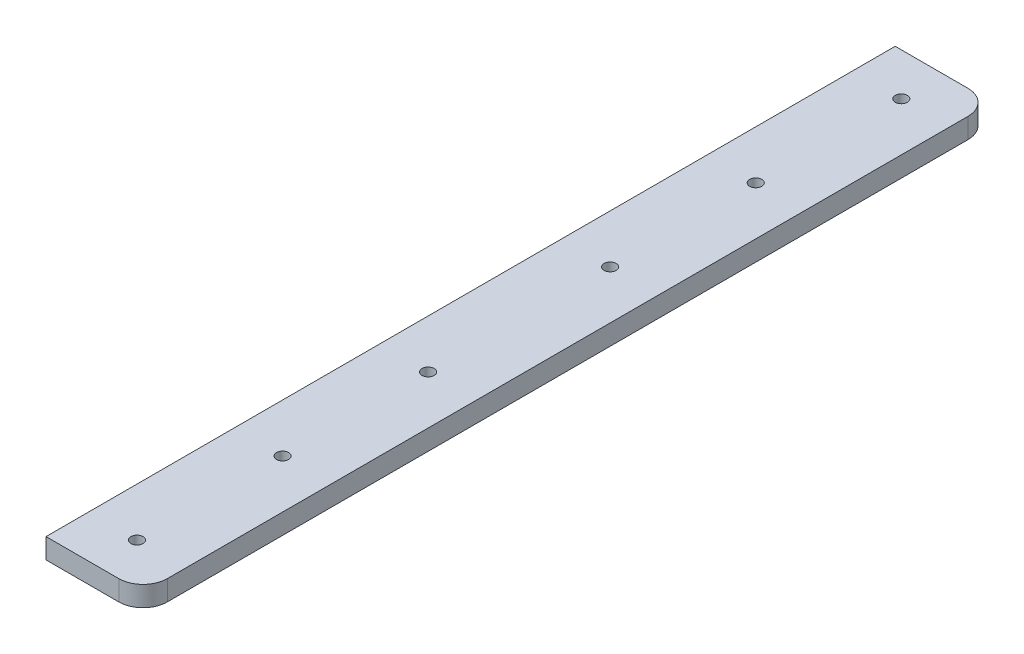
ISO-10303-21;
HEADER;
FILE_DESCRIPTION(('STEP AP214'),'2;1');
FILE_NAME('part.step','',(''),(''),'','','');
FILE_SCHEMA(('AUTOMOTIVE_DESIGN { 1 0 10303 214 1 1 1 1 }'));
ENDSEC;
DATA;
#1=APPLICATION_CONTEXT('core data for automotive mechanical design processes');
#2=APPLICATION_PROTOCOL_DEFINITION('international standard','automotive_design',2000,#1);
#3=PRODUCT_CONTEXT('',#1,'mechanical');
#4=PRODUCT('Part','Part','',(#3));
#5=PRODUCT_RELATED_PRODUCT_CATEGORY('part','',(#4));
#6=PRODUCT_DEFINITION_FORMATION('','',#4);
#7=PRODUCT_DEFINITION_CONTEXT('part definition',#1,'design');
#8=PRODUCT_DEFINITION('design','',#6,#7);
#9=PRODUCT_DEFINITION_SHAPE('','',#8);
#10=(LENGTH_UNIT() NAMED_UNIT(*) SI_UNIT(.MILLI.,.METRE.));
#11=(NAMED_UNIT(*) PLANE_ANGLE_UNIT() SI_UNIT($,.RADIAN.));
#12=(NAMED_UNIT(*) SI_UNIT($,.STERADIAN.) SOLID_ANGLE_UNIT());
#13=UNCERTAINTY_MEASURE_WITH_UNIT(LENGTH_MEASURE(1.E-05),#10,'distance_accuracy_value','');
#14=(GEOMETRIC_REPRESENTATION_CONTEXT(3) GLOBAL_UNCERTAINTY_ASSIGNED_CONTEXT((#13)) GLOBAL_UNIT_ASSIGNED_CONTEXT((#10,
#11,#12)) REPRESENTATION_CONTEXT('',''));
#15=CARTESIAN_POINT('',(0.,0.,0.));
#16=DIRECTION('',(0.,0.,1.));
#17=DIRECTION('',(1.,0.,0.));
#18=AXIS2_PLACEMENT_3D('',#15,#16,#17);
#19=CARTESIAN_POINT('',(6.00000000000003,5.,99.));
#20=DIRECTION('',(0.,1.,0.));
#21=DIRECTION('',(0.,0.,1.));
#22=AXIS2_PLACEMENT_3D('',#19,#20,#21);
#23=PLANE('',#22);
#24=CARTESIAN_POINT('',(0.,5.,-58.5));
#25=DIRECTION('',(0.,1.,0.));
#26=DIRECTION('',(0.,0.,-1.));
#27=AXIS2_PLACEMENT_3D('',#24,#25,#26);
#28=CIRCLE('',#27,1.5);
#29=CARTESIAN_POINT('',(0.,5.,-60.));
#30=VERTEX_POINT('',#29);
#31=EDGE_CURVE('E203',#30,#30,#28,.T.);
#32=ORIENTED_EDGE('',*,*,#31,.F.);
#33=EDGE_LOOP('',(#32));
#34=FACE_BOUND('',#33,.T.);
#35=CARTESIAN_POINT('',(-2.22044604925031E-13,5.,22.5));
#36=DIRECTION('',(0.,1.,0.));
#37=DIRECTION('',(0.,0.,1.));
#38=AXIS2_PLACEMENT_3D('',#35,#36,#37);
#39=CIRCLE('',#38,1.5);
#40=CARTESIAN_POINT('',(-2.22044604925031E-13,5.,24.));
#41=VERTEX_POINT('',#40);
#42=EDGE_CURVE('E215',#41,#41,#39,.T.);
#43=ORIENTED_EDGE('',*,*,#42,.F.);
#44=EDGE_LOOP('',(#43));
#45=FACE_BOUND('',#44,.T.);
#46=CARTESIAN_POINT('',(3.35731442646647E-13,5.,94.5));
#47=DIRECTION('',(0.,1.,0.));
#48=DIRECTION('',(0.,0.,1.));
#49=AXIS2_PLACEMENT_3D('',#46,#47,#48);
#50=CIRCLE('',#49,1.4999999999997);
#51=CARTESIAN_POINT('',(3.35731442646647E-13,5.,95.9999999999997));
#52=VERTEX_POINT('',#51);
#53=EDGE_CURVE('E128',#52,#52,#50,.T.);
#54=ORIENTED_EDGE('',*,*,#53,.F.);
#55=EDGE_LOOP('',(#54));
#56=FACE_BOUND('',#55,.T.);
#57=CARTESIAN_POINT('',(6.00000000000003,5.,99.));
#58=DIRECTION('',(0.,1.,0.));
#59=DIRECTION('',(0.,0.,1.));
#60=AXIS2_PLACEMENT_3D('',#57,#58,#59);
#61=CIRCLE('',#60,5.99999999999998);
#62=CARTESIAN_POINT('',(6.00000000000003,5.,105.));
#63=VERTEX_POINT('',#62);
#64=CARTESIAN_POINT('',(12.,5.,99.));
#65=VERTEX_POINT('',#64);
#66=EDGE_CURVE('E135',#63,#65,#61,.T.);
#67=ORIENTED_EDGE('',*,*,#66,.T.);
#68=DIRECTION('',(0.,0.,-1.));
#69=VECTOR('',#68,1.);
#70=CARTESIAN_POINT('',(12.,5.,-99.));
#71=LINE('',#70,#69);
#72=CARTESIAN_POINT('',(12.,5.,-99.));
#73=VERTEX_POINT('',#72);
#74=EDGE_CURVE('E93',#65,#73,#71,.T.);
#75=ORIENTED_EDGE('',*,*,#74,.T.);
#76=CARTESIAN_POINT('',(6.00000000000003,5.,-99.));
#77=DIRECTION('',(0.,1.,0.));
#78=DIRECTION('',(0.,0.,1.));
#79=AXIS2_PLACEMENT_3D('',#76,#77,#78);
#80=CIRCLE('',#79,5.99999999999998);
#81=CARTESIAN_POINT('',(6.00000000000003,5.,-105.));
#82=VERTEX_POINT('',#81);
#83=EDGE_CURVE('E106',#73,#82,#80,.T.);
#84=ORIENTED_EDGE('',*,*,#83,.T.);
#85=DIRECTION('',(-1.,0.,0.));
#86=VECTOR('',#85,1.);
#87=CARTESIAN_POINT('',(-12.0000000000003,5.,-105.));
#88=LINE('',#87,#86);
#89=CARTESIAN_POINT('',(-12.0000000000003,5.,-105.));
#90=VERTEX_POINT('',#89);
#91=EDGE_CURVE('E100',#82,#90,#88,.T.);
#92=ORIENTED_EDGE('',*,*,#91,.T.);
#93=DIRECTION('',(0.,0.,1.));
#94=VECTOR('',#93,1.);
#95=CARTESIAN_POINT('',(-12.0000000000003,5.,105.));
#96=LINE('',#95,#94);
#97=CARTESIAN_POINT('',(-12.0000000000003,5.,105.));
#98=VERTEX_POINT('',#97);
#99=EDGE_CURVE('E104',#90,#98,#96,.T.);
#100=ORIENTED_EDGE('',*,*,#99,.T.);
#101=DIRECTION('',(1.,0.,0.));
#102=VECTOR('',#101,1.);
#103=CARTESIAN_POINT('',(6.00000000000003,5.,105.));
#104=LINE('',#103,#102);
#105=EDGE_CURVE('E56',#98,#63,#104,.T.);
#106=ORIENTED_EDGE('',*,*,#105,.T.);
#107=EDGE_LOOP('',(#67,#75,#84,#92,#100,#106));
#108=FACE_BOUND('',#107,.T.);
#109=CARTESIAN_POINT('',(0.,5.,58.5));
#110=DIRECTION('',(0.,1.,0.));
#111=DIRECTION('',(0.,0.,1.));
#112=AXIS2_PLACEMENT_3D('',#109,#110,#111);
#113=CIRCLE('',#112,1.5);
#114=CARTESIAN_POINT('',(0.,5.,60.));
#115=VERTEX_POINT('',#114);
#116=EDGE_CURVE('E221',#115,#115,#113,.T.);
#117=ORIENTED_EDGE('',*,*,#116,.F.);
#118=EDGE_LOOP('',(#117));
#119=FACE_BOUND('',#118,.T.);
#120=CARTESIAN_POINT('',(0.,5.,-94.5));
#121=DIRECTION('',(0.,1.,0.));
#122=DIRECTION('',(0.,0.,-1.));
#123=AXIS2_PLACEMENT_3D('',#120,#121,#122);
#124=CIRCLE('',#123,1.5);
#125=CARTESIAN_POINT('',(0.,5.,-96.));
#126=VERTEX_POINT('',#125);
#127=EDGE_CURVE('E209',#126,#126,#124,.T.);
#128=ORIENTED_EDGE('',*,*,#127,.F.);
#129=EDGE_LOOP('',(#128));
#130=FACE_BOUND('',#129,.T.);
#131=CARTESIAN_POINT('',(-2.22044604925031E-13,5.,-22.5));
#132=DIRECTION('',(0.,1.,0.));
#133=DIRECTION('',(0.,0.,-1.));
#134=AXIS2_PLACEMENT_3D('',#131,#132,#133);
#135=CIRCLE('',#134,1.5);
#136=CARTESIAN_POINT('',(-2.22044604925031E-13,5.,-24.));
#137=VERTEX_POINT('',#136);
#138=EDGE_CURVE('E194',#137,#137,#135,.T.);
#139=ORIENTED_EDGE('',*,*,#138,.F.);
#140=EDGE_LOOP('',(#139));
#141=FACE_BOUND('',#140,.T.);
#142=ADVANCED_FACE('F39',(#34,#45,#56,#108,#119,#130,#141),#23,.T.);
#143=CARTESIAN_POINT('',(6.00000000000003,0.,99.));
#144=DIRECTION('',(0.,1.,0.));
#145=DIRECTION('',(0.,0.,1.));
#146=AXIS2_PLACEMENT_3D('',#143,#144,#145);
#147=PLANE('',#146);
#148=CARTESIAN_POINT('',(6.00000000000003,0.,99.));
#149=DIRECTION('',(0.,1.,0.));
#150=DIRECTION('',(0.,0.,1.));
#151=AXIS2_PLACEMENT_3D('',#148,#149,#150);
#152=CIRCLE('',#151,5.99999999999998);
#153=CARTESIAN_POINT('',(6.00000000000003,0.,105.));
#154=VERTEX_POINT('',#153);
#155=CARTESIAN_POINT('',(12.,0.,99.));
#156=VERTEX_POINT('',#155);
#157=EDGE_CURVE('E124',#154,#156,#152,.T.);
#158=ORIENTED_EDGE('',*,*,#157,.F.);
#159=DIRECTION('',(1.,0.,0.));
#160=VECTOR('',#159,1.);
#161=CARTESIAN_POINT('',(6.00000000000003,0.,105.));
#162=LINE('',#161,#160);
#163=CARTESIAN_POINT('',(-12.0000000000003,0.,105.));
#164=VERTEX_POINT('',#163);
#165=EDGE_CURVE('E85',#164,#154,#162,.T.);
#166=ORIENTED_EDGE('',*,*,#165,.F.);
#167=DIRECTION('',(0.,0.,1.));
#168=VECTOR('',#167,1.);
#169=CARTESIAN_POINT('',(-12.0000000000003,0.,105.));
#170=LINE('',#169,#168);
#171=CARTESIAN_POINT('',(-12.0000000000003,0.,-105.));
#172=VERTEX_POINT('',#171);
#173=EDGE_CURVE('E79',#172,#164,#170,.T.);
#174=ORIENTED_EDGE('',*,*,#173,.F.);
#175=DIRECTION('',(-1.,0.,0.));
#176=VECTOR('',#175,1.);
#177=CARTESIAN_POINT('',(-12.0000000000003,0.,-105.));
#178=LINE('',#177,#176);
#179=CARTESIAN_POINT('',(6.00000000000003,0.,-105.));
#180=VERTEX_POINT('',#179);
#181=EDGE_CURVE('E114',#180,#172,#178,.T.);
#182=ORIENTED_EDGE('',*,*,#181,.F.);
#183=CARTESIAN_POINT('',(6.00000000000003,0.,-99.));
#184=DIRECTION('',(0.,1.,0.));
#185=DIRECTION('',(0.,0.,1.));
#186=AXIS2_PLACEMENT_3D('',#183,#184,#185);
#187=CIRCLE('',#186,5.99999999999998);
#188=CARTESIAN_POINT('',(12.,0.,-99.));
#189=VERTEX_POINT('',#188);
#190=EDGE_CURVE('E130',#189,#180,#187,.T.);
#191=ORIENTED_EDGE('',*,*,#190,.F.);
#192=DIRECTION('',(0.,0.,-1.));
#193=VECTOR('',#192,1.);
#194=CARTESIAN_POINT('',(12.,0.,-99.));
#195=LINE('',#194,#193);
#196=EDGE_CURVE('E127',#156,#189,#195,.T.);
#197=ORIENTED_EDGE('',*,*,#196,.F.);
#198=EDGE_LOOP('',(#158,#166,#174,#182,#191,#197));
#199=FACE_BOUND('',#198,.T.);
#200=CARTESIAN_POINT('',(3.35731442646647E-13,0.,94.5));
#201=DIRECTION('',(0.,1.,0.));
#202=DIRECTION('',(0.,0.,1.));
#203=AXIS2_PLACEMENT_3D('',#200,#201,#202);
#204=CIRCLE('',#203,1.4999999999997);
#205=CARTESIAN_POINT('',(3.35731442646647E-13,0.,95.9999999999997));
#206=VERTEX_POINT('',#205);
#207=EDGE_CURVE('E224',#206,#206,#204,.T.);
#208=ORIENTED_EDGE('',*,*,#207,.T.);
#209=EDGE_LOOP('',(#208));
#210=FACE_BOUND('',#209,.T.);
#211=CARTESIAN_POINT('',(0.,0.,58.5));
#212=DIRECTION('',(0.,1.,0.));
#213=DIRECTION('',(0.,0.,1.));
#214=AXIS2_PLACEMENT_3D('',#211,#212,#213);
#215=CIRCLE('',#214,1.5);
#216=CARTESIAN_POINT('',(0.,0.,60.));
#217=VERTEX_POINT('',#216);
#218=EDGE_CURVE('E218',#217,#217,#215,.T.);
#219=ORIENTED_EDGE('',*,*,#218,.T.);
#220=EDGE_LOOP('',(#219));
#221=FACE_BOUND('',#220,.T.);
#222=CARTESIAN_POINT('',(-2.22044604925031E-13,0.,22.5));
#223=DIRECTION('',(0.,1.,0.));
#224=DIRECTION('',(0.,0.,1.));
#225=AXIS2_PLACEMENT_3D('',#222,#223,#224);
#226=CIRCLE('',#225,1.5);
#227=CARTESIAN_POINT('',(-2.22044604925031E-13,0.,24.));
#228=VERTEX_POINT('',#227);
#229=EDGE_CURVE('E212',#228,#228,#226,.T.);
#230=ORIENTED_EDGE('',*,*,#229,.T.);
#231=EDGE_LOOP('',(#230));
#232=FACE_BOUND('',#231,.T.);
#233=CARTESIAN_POINT('',(0.,0.,-94.5));
#234=DIRECTION('',(0.,1.,0.));
#235=DIRECTION('',(0.,0.,-1.));
#236=AXIS2_PLACEMENT_3D('',#233,#234,#235);
#237=CIRCLE('',#236,1.5);
#238=CARTESIAN_POINT('',(0.,0.,-96.));
#239=VERTEX_POINT('',#238);
#240=EDGE_CURVE('E206',#239,#239,#237,.T.);
#241=ORIENTED_EDGE('',*,*,#240,.T.);
#242=EDGE_LOOP('',(#241));
#243=FACE_BOUND('',#242,.T.);
#244=CARTESIAN_POINT('',(0.,0.,-58.5));
#245=DIRECTION('',(0.,1.,0.));
#246=DIRECTION('',(0.,0.,-1.));
#247=AXIS2_PLACEMENT_3D('',#244,#245,#246);
#248=CIRCLE('',#247,1.5);
#249=CARTESIAN_POINT('',(0.,0.,-60.));
#250=VERTEX_POINT('',#249);
#251=EDGE_CURVE('E200',#250,#250,#248,.T.);
#252=ORIENTED_EDGE('',*,*,#251,.T.);
#253=EDGE_LOOP('',(#252));
#254=FACE_BOUND('',#253,.T.);
#255=CARTESIAN_POINT('',(-2.22044604925031E-13,0.,-22.5));
#256=DIRECTION('',(0.,1.,0.));
#257=DIRECTION('',(0.,0.,-1.));
#258=AXIS2_PLACEMENT_3D('',#255,#256,#257);
#259=CIRCLE('',#258,1.5);
#260=CARTESIAN_POINT('',(-2.22044604925031E-13,0.,-24.));
#261=VERTEX_POINT('',#260);
#262=EDGE_CURVE('E197',#261,#261,#259,.T.);
#263=ORIENTED_EDGE('',*,*,#262,.T.);
#264=EDGE_LOOP('',(#263));
#265=FACE_BOUND('',#264,.T.);
#266=ADVANCED_FACE('F144',(#199,#210,#221,#232,#243,#254,#265),#147,.F.);
#267=CARTESIAN_POINT('',(6.00000000000003,5.,99.));
#268=DIRECTION('',(0.,-1.,0.));
#269=DIRECTION('',(0.,0.,-1.));
#270=AXIS2_PLACEMENT_3D('',#267,#268,#269);
#271=CYLINDRICAL_SURFACE('',#270,5.99999999999998);
#272=ORIENTED_EDGE('',*,*,#157,.T.);
#273=DIRECTION('',(0.,-1.,0.));
#274=VECTOR('',#273,1.);
#275=CARTESIAN_POINT('',(12.,5.,99.));
#276=LINE('',#275,#274);
#277=EDGE_CURVE('E11',#65,#156,#276,.T.);
#278=ORIENTED_EDGE('',*,*,#277,.F.);
#279=ORIENTED_EDGE('',*,*,#66,.F.);
#280=DIRECTION('',(0.,-1.,0.));
#281=VECTOR('',#280,1.);
#282=CARTESIAN_POINT('',(6.00000000000003,5.,105.));
#283=LINE('',#282,#281);
#284=EDGE_CURVE('E120',#63,#154,#283,.T.);
#285=ORIENTED_EDGE('',*,*,#284,.T.);
#286=EDGE_LOOP('',(#272,#278,#279,#285));
#287=FACE_BOUND('',#286,.T.);
#288=ADVANCED_FACE('F41',(#287),#271,.T.);
#289=CARTESIAN_POINT('',(12.,5.,-99.));
#290=DIRECTION('',(-1.,0.,0.));
#291=DIRECTION('',(0.,0.,1.));
#292=AXIS2_PLACEMENT_3D('',#289,#290,#291);
#293=PLANE('',#292);
#294=ORIENTED_EDGE('',*,*,#196,.T.);
#295=DIRECTION('',(0.,-1.,0.));
#296=VECTOR('',#295,1.);
#297=CARTESIAN_POINT('',(12.,5.,-99.));
#298=LINE('',#297,#296);
#299=EDGE_CURVE('E48',#73,#189,#298,.T.);
#300=ORIENTED_EDGE('',*,*,#299,.F.);
#301=ORIENTED_EDGE('',*,*,#74,.F.);
#302=ORIENTED_EDGE('',*,*,#277,.T.);
#303=EDGE_LOOP('',(#294,#300,#301,#302));
#304=FACE_BOUND('',#303,.T.);
#305=ADVANCED_FACE('F306',(#304),#293,.F.);
#306=CARTESIAN_POINT('',(6.00000000000003,5.,-99.));
#307=DIRECTION('',(0.,-1.,0.));
#308=DIRECTION('',(0.,0.,-1.));
#309=AXIS2_PLACEMENT_3D('',#306,#307,#308);
#310=CYLINDRICAL_SURFACE('',#309,5.99999999999998);
#311=ORIENTED_EDGE('',*,*,#190,.T.);
#312=DIRECTION('',(0.,-1.,0.));
#313=VECTOR('',#312,1.);
#314=CARTESIAN_POINT('',(6.00000000000003,5.,-105.));
#315=LINE('',#314,#313);
#316=EDGE_CURVE('E115',#82,#180,#315,.T.);
#317=ORIENTED_EDGE('',*,*,#316,.F.);
#318=ORIENTED_EDGE('',*,*,#83,.F.);
#319=ORIENTED_EDGE('',*,*,#299,.T.);
#320=EDGE_LOOP('',(#311,#317,#318,#319));
#321=FACE_BOUND('',#320,.T.);
#322=ADVANCED_FACE('F141',(#321),#310,.T.);
#323=CARTESIAN_POINT('',(-12.0000000000003,5.,-105.));
#324=DIRECTION('',(0.,0.,1.));
#325=DIRECTION('',(1.,0.,0.));
#326=AXIS2_PLACEMENT_3D('',#323,#324,#325);
#327=PLANE('',#326);
#328=ORIENTED_EDGE('',*,*,#181,.T.);
#329=DIRECTION('',(0.,-1.,0.));
#330=VECTOR('',#329,1.);
#331=CARTESIAN_POINT('',(-12.0000000000003,5.,-105.));
#332=LINE('',#331,#330);
#333=EDGE_CURVE('E111',#90,#172,#332,.T.);
#334=ORIENTED_EDGE('',*,*,#333,.F.);
#335=ORIENTED_EDGE('',*,*,#91,.F.);
#336=ORIENTED_EDGE('',*,*,#316,.T.);
#337=EDGE_LOOP('',(#328,#334,#335,#336));
#338=FACE_BOUND('',#337,.T.);
#339=ADVANCED_FACE('F112',(#338),#327,.F.);
#340=CARTESIAN_POINT('',(-12.0000000000003,5.,105.));
#341=DIRECTION('',(1.,0.,0.));
#342=DIRECTION('',(0.,0.,-1.));
#343=AXIS2_PLACEMENT_3D('',#340,#341,#342);
#344=PLANE('',#343);
#345=ORIENTED_EDGE('',*,*,#173,.T.);
#346=DIRECTION('',(0.,-1.,0.));
#347=VECTOR('',#346,1.);
#348=CARTESIAN_POINT('',(-12.0000000000003,5.,105.));
#349=LINE('',#348,#347);
#350=EDGE_CURVE('E116',#98,#164,#349,.T.);
#351=ORIENTED_EDGE('',*,*,#350,.F.);
#352=ORIENTED_EDGE('',*,*,#99,.F.);
#353=ORIENTED_EDGE('',*,*,#333,.T.);
#354=EDGE_LOOP('',(#345,#351,#352,#353));
#355=FACE_BOUND('',#354,.T.);
#356=ADVANCED_FACE('F118',(#355),#344,.F.);
#357=CARTESIAN_POINT('',(6.00000000000003,5.,105.));
#358=DIRECTION('',(0.,0.,-1.));
#359=DIRECTION('',(-1.,0.,0.));
#360=AXIS2_PLACEMENT_3D('',#357,#358,#359);
#361=PLANE('',#360);
#362=ORIENTED_EDGE('',*,*,#165,.T.);
#363=ORIENTED_EDGE('',*,*,#284,.F.);
#364=ORIENTED_EDGE('',*,*,#105,.F.);
#365=ORIENTED_EDGE('',*,*,#350,.T.);
#366=EDGE_LOOP('',(#362,#363,#364,#365));
#367=FACE_BOUND('',#366,.T.);
#368=ADVANCED_FACE('F149',(#367),#361,.F.);
#369=CARTESIAN_POINT('',(3.35731442646647E-13,5.,94.5));
#370=DIRECTION('',(0.,-1.,0.));
#371=DIRECTION('',(0.,0.,-1.));
#372=AXIS2_PLACEMENT_3D('',#369,#370,#371);
#373=CYLINDRICAL_SURFACE('',#372,1.4999999999997);
#374=ORIENTED_EDGE('',*,*,#53,.T.);
#375=EDGE_LOOP('',(#374));
#376=FACE_BOUND('',#375,.T.);
#377=ORIENTED_EDGE('',*,*,#207,.F.);
#378=EDGE_LOOP('',(#377));
#379=FACE_BOUND('',#378,.T.);
#380=ADVANCED_FACE('F151',(#376,#379),#373,.F.);
#381=CARTESIAN_POINT('',(0.,5.,58.5));
#382=DIRECTION('',(0.,-1.,0.));
#383=DIRECTION('',(0.,0.,-1.));
#384=AXIS2_PLACEMENT_3D('',#381,#382,#383);
#385=CYLINDRICAL_SURFACE('',#384,1.5);
#386=ORIENTED_EDGE('',*,*,#116,.T.);
#387=EDGE_LOOP('',(#386));
#388=FACE_BOUND('',#387,.T.);
#389=ORIENTED_EDGE('',*,*,#218,.F.);
#390=EDGE_LOOP('',(#389));
#391=FACE_BOUND('',#390,.T.);
#392=ADVANCED_FACE('F157',(#388,#391),#385,.F.);
#393=CARTESIAN_POINT('',(-2.22044604925031E-13,5.,22.5));
#394=DIRECTION('',(0.,-1.,0.));
#395=DIRECTION('',(0.,0.,-1.));
#396=AXIS2_PLACEMENT_3D('',#393,#394,#395);
#397=CYLINDRICAL_SURFACE('',#396,1.5);
#398=ORIENTED_EDGE('',*,*,#42,.T.);
#399=EDGE_LOOP('',(#398));
#400=FACE_BOUND('',#399,.T.);
#401=ORIENTED_EDGE('',*,*,#229,.F.);
#402=EDGE_LOOP('',(#401));
#403=FACE_BOUND('',#402,.T.);
#404=ADVANCED_FACE('F173',(#400,#403),#397,.F.);
#405=CARTESIAN_POINT('',(0.,5.,-94.5));
#406=DIRECTION('',(0.,-1.,0.));
#407=DIRECTION('',(0.,0.,-1.));
#408=AXIS2_PLACEMENT_3D('',#405,#406,#407);
#409=CYLINDRICAL_SURFACE('',#408,1.5);
#410=ORIENTED_EDGE('',*,*,#127,.T.);
#411=EDGE_LOOP('',(#410));
#412=FACE_BOUND('',#411,.T.);
#413=ORIENTED_EDGE('',*,*,#240,.F.);
#414=EDGE_LOOP('',(#413));
#415=FACE_BOUND('',#414,.T.);
#416=ADVANCED_FACE('F177',(#412,#415),#409,.F.);
#417=CARTESIAN_POINT('',(0.,5.,-58.5));
#418=DIRECTION('',(0.,-1.,0.));
#419=DIRECTION('',(0.,0.,-1.));
#420=AXIS2_PLACEMENT_3D('',#417,#418,#419);
#421=CYLINDRICAL_SURFACE('',#420,1.5);
#422=ORIENTED_EDGE('',*,*,#31,.T.);
#423=EDGE_LOOP('',(#422));
#424=FACE_BOUND('',#423,.T.);
#425=ORIENTED_EDGE('',*,*,#251,.F.);
#426=EDGE_LOOP('',(#425));
#427=FACE_BOUND('',#426,.T.);
#428=ADVANCED_FACE('F181',(#424,#427),#421,.F.);
#429=CARTESIAN_POINT('',(-2.22044604925031E-13,5.,-22.5));
#430=DIRECTION('',(0.,-1.,0.));
#431=DIRECTION('',(0.,0.,-1.));
#432=AXIS2_PLACEMENT_3D('',#429,#430,#431);
#433=CYLINDRICAL_SURFACE('',#432,1.5);
#434=ORIENTED_EDGE('',*,*,#138,.T.);
#435=EDGE_LOOP('',(#434));
#436=FACE_BOUND('',#435,.T.);
#437=ORIENTED_EDGE('',*,*,#262,.F.);
#438=EDGE_LOOP('',(#437));
#439=FACE_BOUND('',#438,.T.);
#440=ADVANCED_FACE('F185',(#436,#439),#433,.F.);
#441=CLOSED_SHELL('',(#142,#266,#288,#305,#322,#339,#356,#368,#380,#392,#404,#416,#428,#440));
#442=MANIFOLD_SOLID_BREP('B2',#441);
#443=ADVANCED_BREP_SHAPE_REPRESENTATION('',(#18,#442),#14);
#444=SHAPE_DEFINITION_REPRESENTATION(#9,#443);
ENDSEC;
END-ISO-10303-21;
